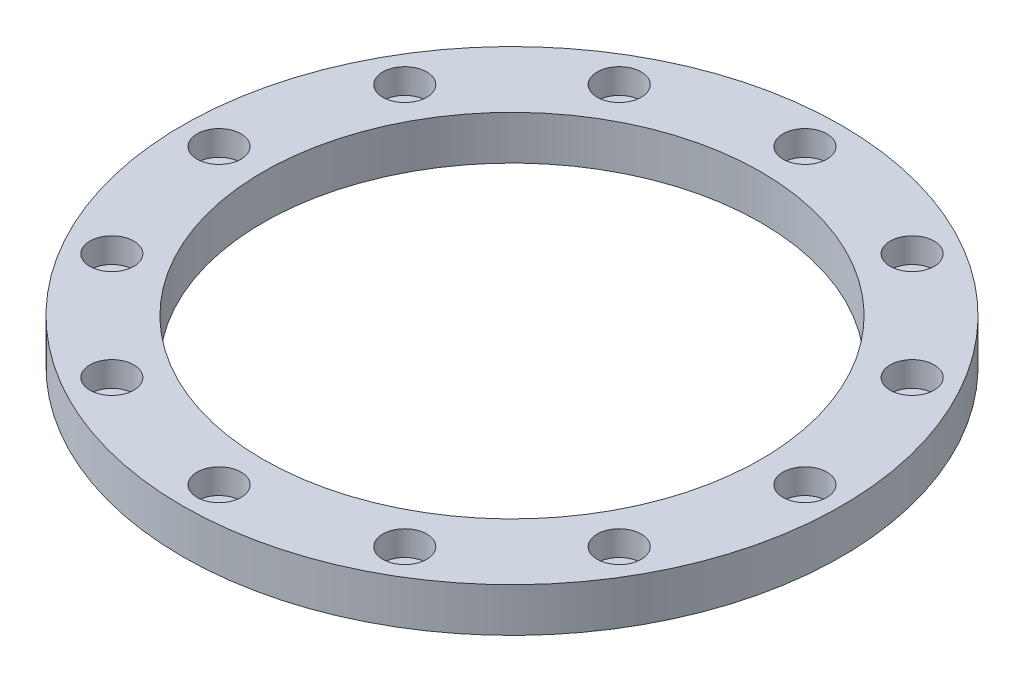
ISO-10303-21;
HEADER;
FILE_DESCRIPTION(('STEP AP214'),'2;1');
FILE_NAME('part.step','',(''),(''),'','','');
FILE_SCHEMA(('AUTOMOTIVE_DESIGN { 1 0 10303 214 1 1 1 1 }'));
ENDSEC;
DATA;
#1=APPLICATION_CONTEXT('core data for automotive mechanical design processes');
#2=APPLICATION_PROTOCOL_DEFINITION('international standard','automotive_design',2000,#1);
#3=PRODUCT_CONTEXT('',#1,'mechanical');
#4=PRODUCT('Part','Part','',(#3));
#5=PRODUCT_RELATED_PRODUCT_CATEGORY('part','',(#4));
#6=PRODUCT_DEFINITION_FORMATION('','',#4);
#7=PRODUCT_DEFINITION_CONTEXT('part definition',#1,'design');
#8=PRODUCT_DEFINITION('design','',#6,#7);
#9=PRODUCT_DEFINITION_SHAPE('','',#8);
#10=(LENGTH_UNIT() NAMED_UNIT(*) SI_UNIT(.MILLI.,.METRE.));
#11=(NAMED_UNIT(*) PLANE_ANGLE_UNIT() SI_UNIT($,.RADIAN.));
#12=(NAMED_UNIT(*) SI_UNIT($,.STERADIAN.) SOLID_ANGLE_UNIT());
#13=UNCERTAINTY_MEASURE_WITH_UNIT(LENGTH_MEASURE(1.E-05),#10,'distance_accuracy_value','');
#14=(GEOMETRIC_REPRESENTATION_CONTEXT(3) GLOBAL_UNCERTAINTY_ASSIGNED_CONTEXT((#13)) GLOBAL_UNIT_ASSIGNED_CONTEXT((#10,
#11,#12)) REPRESENTATION_CONTEXT('',''));
#15=CARTESIAN_POINT('',(0.,0.,0.));
#16=DIRECTION('',(0.,0.,1.));
#17=DIRECTION('',(1.,0.,0.));
#18=AXIS2_PLACEMENT_3D('',#15,#16,#17);
#19=CARTESIAN_POINT('',(0.,6.,0.));
#20=DIRECTION('',(0.,1.,0.));
#21=DIRECTION('',(0.,0.,1.));
#22=AXIS2_PLACEMENT_3D('',#19,#20,#21);
#23=PLANE('',#22);
#24=CARTESIAN_POINT('',(-19.9999999999996,6.,-34.6410161513778));
#25=DIRECTION('',(0.,1.,0.));
#26=DIRECTION('',(0.,0.,1.));
#27=AXIS2_PLACEMENT_3D('',#24,#25,#26);
#28=CIRCLE('',#27,3.);
#29=CARTESIAN_POINT('',(-19.9999999999996,6.,-31.6410161513778));
#30=VERTEX_POINT('',#29);
#31=EDGE_CURVE('E192',#30,#30,#28,.T.);
#32=ORIENTED_EDGE('',*,*,#31,.F.);
#33=EDGE_LOOP('',(#32));
#34=FACE_BOUND('',#33,.T.);
#35=CARTESIAN_POINT('',(-34.6410161513773,6.,-20.0000000000004));
#36=DIRECTION('',(0.,1.,0.));
#37=DIRECTION('',(0.,0.,1.));
#38=AXIS2_PLACEMENT_3D('',#35,#36,#37);
#39=CIRCLE('',#38,3.);
#40=CARTESIAN_POINT('',(-34.6410161513773,6.,-17.0000000000004));
#41=VERTEX_POINT('',#40);
#42=EDGE_CURVE('E180',#41,#41,#39,.T.);
#43=ORIENTED_EDGE('',*,*,#42,.F.);
#44=EDGE_LOOP('',(#43));
#45=FACE_BOUND('',#44,.T.);
#46=CARTESIAN_POINT('',(-40.,6.,-4.18977760661176E-13));
#47=DIRECTION('',(0.,1.,0.));
#48=DIRECTION('',(0.,0.,1.));
#49=AXIS2_PLACEMENT_3D('',#46,#47,#48);
#50=CIRCLE('',#49,3.);
#51=CARTESIAN_POINT('',(-40.,6.,2.99999999999958));
#52=VERTEX_POINT('',#51);
#53=EDGE_CURVE('E168',#52,#52,#50,.T.);
#54=ORIENTED_EDGE('',*,*,#53,.F.);
#55=EDGE_LOOP('',(#54));
#56=FACE_BOUND('',#55,.T.);
#57=CARTESIAN_POINT('',(-34.6410161513777,6.,19.9999999999997));
#58=DIRECTION('',(0.,1.,0.));
#59=DIRECTION('',(0.,0.,1.));
#60=AXIS2_PLACEMENT_3D('',#57,#58,#59);
#61=CIRCLE('',#60,3.);
#62=CARTESIAN_POINT('',(-34.6410161513777,6.,22.9999999999997));
#63=VERTEX_POINT('',#62);
#64=EDGE_CURVE('E156',#63,#63,#61,.T.);
#65=ORIENTED_EDGE('',*,*,#64,.F.);
#66=EDGE_LOOP('',(#65));
#67=FACE_BOUND('',#66,.T.);
#68=CARTESIAN_POINT('',(-20.0000000000003,6.,34.6410161513774));
#69=DIRECTION('',(0.,1.,0.));
#70=DIRECTION('',(0.,0.,1.));
#71=AXIS2_PLACEMENT_3D('',#68,#69,#70);
#72=CIRCLE('',#71,3.);
#73=CARTESIAN_POINT('',(-20.0000000000003,6.,37.6410161513774));
#74=VERTEX_POINT('',#73);
#75=EDGE_CURVE('E144',#74,#74,#72,.T.);
#76=ORIENTED_EDGE('',*,*,#75,.F.);
#77=EDGE_LOOP('',(#76));
#78=FACE_BOUND('',#77,.T.);
#79=CARTESIAN_POINT('',(0.,6.,40.));
#80=DIRECTION('',(0.,1.,0.));
#81=DIRECTION('',(0.,0.,1.));
#82=AXIS2_PLACEMENT_3D('',#79,#80,#81);
#83=CIRCLE('',#82,3.);
#84=CARTESIAN_POINT('',(0.,6.,43.));
#85=VERTEX_POINT('',#84);
#86=EDGE_CURVE('E132',#85,#85,#83,.T.);
#87=ORIENTED_EDGE('',*,*,#86,.F.);
#88=EDGE_LOOP('',(#87));
#89=FACE_BOUND('',#88,.T.);
#90=CARTESIAN_POINT('',(19.9999999999998,6.,34.6410161513777));
#91=DIRECTION('',(0.,1.,0.));
#92=DIRECTION('',(0.,0.,1.));
#93=AXIS2_PLACEMENT_3D('',#90,#91,#92);
#94=CIRCLE('',#93,3.);
#95=CARTESIAN_POINT('',(19.9999999999998,6.,37.6410161513777));
#96=VERTEX_POINT('',#95);
#97=EDGE_CURVE('E120',#96,#96,#94,.T.);
#98=ORIENTED_EDGE('',*,*,#97,.F.);
#99=EDGE_LOOP('',(#98));
#100=FACE_BOUND('',#99,.T.);
#101=CARTESIAN_POINT('',(34.6410161513775,6.,20.0000000000002));
#102=DIRECTION('',(0.,1.,0.));
#103=DIRECTION('',(0.,0.,1.));
#104=AXIS2_PLACEMENT_3D('',#101,#102,#103);
#105=CIRCLE('',#104,3.);
#106=CARTESIAN_POINT('',(34.6410161513775,6.,23.0000000000002));
#107=VERTEX_POINT('',#106);
#108=EDGE_CURVE('E108',#107,#107,#105,.T.);
#109=ORIENTED_EDGE('',*,*,#108,.F.);
#110=EDGE_LOOP('',(#109));
#111=FACE_BOUND('',#110,.T.);
#112=CARTESIAN_POINT('',(40.,6.,1.39659253553725E-13));
#113=DIRECTION('',(0.,1.,0.));
#114=DIRECTION('',(0.,0.,1.));
#115=AXIS2_PLACEMENT_3D('',#112,#113,#114);
#116=CIRCLE('',#115,3.);
#117=CARTESIAN_POINT('',(40.,6.,3.00000000000014));
#118=VERTEX_POINT('',#117);
#119=EDGE_CURVE('E96',#118,#118,#116,.T.);
#120=ORIENTED_EDGE('',*,*,#119,.F.);
#121=EDGE_LOOP('',(#120));
#122=FACE_BOUND('',#121,.T.);
#123=CARTESIAN_POINT('',(34.6410161513776,6.,-19.9999999999999));
#124=DIRECTION('',(0.,1.,0.));
#125=DIRECTION('',(0.,0.,1.));
#126=AXIS2_PLACEMENT_3D('',#123,#124,#125);
#127=CIRCLE('',#126,3.);
#128=CARTESIAN_POINT('',(34.6410161513776,6.,-16.9999999999999));
#129=VERTEX_POINT('',#128);
#130=EDGE_CURVE('E84',#129,#129,#127,.T.);
#131=ORIENTED_EDGE('',*,*,#130,.F.);
#132=EDGE_LOOP('',(#131));
#133=FACE_BOUND('',#132,.T.);
#134=CARTESIAN_POINT('',(20.,6.,-34.6410161513775));
#135=DIRECTION('',(0.,1.,0.));
#136=DIRECTION('',(0.,0.,1.));
#137=AXIS2_PLACEMENT_3D('',#134,#135,#136);
#138=CIRCLE('',#137,3.);
#139=CARTESIAN_POINT('',(20.,6.,-31.6410161513775));
#140=VERTEX_POINT('',#139);
#141=EDGE_CURVE('E72',#140,#140,#138,.T.);
#142=ORIENTED_EDGE('',*,*,#141,.F.);
#143=EDGE_LOOP('',(#142));
#144=FACE_BOUND('',#143,.T.);
#145=CARTESIAN_POINT('',(0.,6.,-40.));
#146=DIRECTION('',(0.,1.,0.));
#147=DIRECTION('',(0.,0.,1.));
#148=AXIS2_PLACEMENT_3D('',#145,#146,#147);
#149=CIRCLE('',#148,3.);
#150=CARTESIAN_POINT('',(0.,6.,-37.));
#151=VERTEX_POINT('',#150);
#152=EDGE_CURVE('E60',#151,#151,#149,.T.);
#153=ORIENTED_EDGE('',*,*,#152,.F.);
#154=EDGE_LOOP('',(#153));
#155=FACE_BOUND('',#154,.T.);
#156=CARTESIAN_POINT('',(0.,6.,0.));
#157=DIRECTION('',(0.,1.,0.));
#158=DIRECTION('',(0.,0.,1.));
#159=AXIS2_PLACEMENT_3D('',#156,#157,#158);
#160=CIRCLE('',#159,45.);
#161=CARTESIAN_POINT('',(0.,6.,45.));
#162=VERTEX_POINT('',#161);
#163=EDGE_CURVE('E10',#162,#162,#160,.T.);
#164=ORIENTED_EDGE('',*,*,#163,.T.);
#165=EDGE_LOOP('',(#164));
#166=FACE_BOUND('',#165,.T.);
#167=CARTESIAN_POINT('',(0.,6.,0.));
#168=DIRECTION('',(0.,1.,0.));
#169=DIRECTION('',(0.,0.,1.));
#170=AXIS2_PLACEMENT_3D('',#167,#168,#169);
#171=CIRCLE('',#170,34.);
#172=CARTESIAN_POINT('',(0.,6.,34.));
#173=VERTEX_POINT('',#172);
#174=EDGE_CURVE('E44',#173,#173,#171,.T.);
#175=ORIENTED_EDGE('',*,*,#174,.F.);
#176=EDGE_LOOP('',(#175));
#177=FACE_BOUND('',#176,.T.);
#178=ADVANCED_FACE('F33',(#34,#45,#56,#67,#78,#89,#100,#111,#122,#133,#144,#155,#166,#177),#23,.T.);
#179=CARTESIAN_POINT('',(0.,0.,0.));
#180=DIRECTION('',(0.,1.,0.));
#181=DIRECTION('',(0.,0.,1.));
#182=AXIS2_PLACEMENT_3D('',#179,#180,#181);
#183=PLANE('',#182);
#184=CARTESIAN_POINT('',(-19.9999999999996,0.,-34.6410161513778));
#185=DIRECTION('',(0.,1.,0.));
#186=DIRECTION('',(0.,0.,1.));
#187=AXIS2_PLACEMENT_3D('',#184,#185,#186);
#188=CIRCLE('',#187,1.8);
#189=CARTESIAN_POINT('',(-19.9999999999996,0.,-32.8410161513778));
#190=VERTEX_POINT('',#189);
#191=EDGE_CURVE('E183',#190,#190,#188,.T.);
#192=ORIENTED_EDGE('',*,*,#191,.T.);
#193=EDGE_LOOP('',(#192));
#194=FACE_BOUND('',#193,.T.);
#195=CARTESIAN_POINT('',(-34.6410161513773,0.,-20.0000000000004));
#196=DIRECTION('',(0.,1.,0.));
#197=DIRECTION('',(0.,0.,1.));
#198=AXIS2_PLACEMENT_3D('',#195,#196,#197);
#199=CIRCLE('',#198,1.8);
#200=CARTESIAN_POINT('',(-34.6410161513773,0.,-18.2000000000004));
#201=VERTEX_POINT('',#200);
#202=EDGE_CURVE('E171',#201,#201,#199,.T.);
#203=ORIENTED_EDGE('',*,*,#202,.T.);
#204=EDGE_LOOP('',(#203));
#205=FACE_BOUND('',#204,.T.);
#206=CARTESIAN_POINT('',(-40.,0.,-4.18977760661176E-13));
#207=DIRECTION('',(0.,1.,0.));
#208=DIRECTION('',(0.,0.,1.));
#209=AXIS2_PLACEMENT_3D('',#206,#207,#208);
#210=CIRCLE('',#209,1.8);
#211=CARTESIAN_POINT('',(-40.,0.,1.79999999999958));
#212=VERTEX_POINT('',#211);
#213=EDGE_CURVE('E159',#212,#212,#210,.T.);
#214=ORIENTED_EDGE('',*,*,#213,.T.);
#215=EDGE_LOOP('',(#214));
#216=FACE_BOUND('',#215,.T.);
#217=CARTESIAN_POINT('',(-34.6410161513777,0.,19.9999999999997));
#218=DIRECTION('',(0.,1.,0.));
#219=DIRECTION('',(0.,0.,1.));
#220=AXIS2_PLACEMENT_3D('',#217,#218,#219);
#221=CIRCLE('',#220,1.8);
#222=CARTESIAN_POINT('',(-34.6410161513777,0.,21.7999999999997));
#223=VERTEX_POINT('',#222);
#224=EDGE_CURVE('E147',#223,#223,#221,.T.);
#225=ORIENTED_EDGE('',*,*,#224,.T.);
#226=EDGE_LOOP('',(#225));
#227=FACE_BOUND('',#226,.T.);
#228=CARTESIAN_POINT('',(-20.0000000000003,0.,34.6410161513774));
#229=DIRECTION('',(0.,1.,0.));
#230=DIRECTION('',(0.,0.,1.));
#231=AXIS2_PLACEMENT_3D('',#228,#229,#230);
#232=CIRCLE('',#231,1.8);
#233=CARTESIAN_POINT('',(-20.0000000000003,0.,36.4410161513774));
#234=VERTEX_POINT('',#233);
#235=EDGE_CURVE('E135',#234,#234,#232,.T.);
#236=ORIENTED_EDGE('',*,*,#235,.T.);
#237=EDGE_LOOP('',(#236));
#238=FACE_BOUND('',#237,.T.);
#239=CARTESIAN_POINT('',(0.,0.,40.));
#240=DIRECTION('',(0.,1.,0.));
#241=DIRECTION('',(0.,0.,1.));
#242=AXIS2_PLACEMENT_3D('',#239,#240,#241);
#243=CIRCLE('',#242,1.8);
#244=CARTESIAN_POINT('',(0.,0.,41.8));
#245=VERTEX_POINT('',#244);
#246=EDGE_CURVE('E123',#245,#245,#243,.T.);
#247=ORIENTED_EDGE('',*,*,#246,.T.);
#248=EDGE_LOOP('',(#247));
#249=FACE_BOUND('',#248,.T.);
#250=CARTESIAN_POINT('',(19.9999999999998,0.,34.6410161513777));
#251=DIRECTION('',(0.,1.,0.));
#252=DIRECTION('',(0.,0.,1.));
#253=AXIS2_PLACEMENT_3D('',#250,#251,#252);
#254=CIRCLE('',#253,1.8);
#255=CARTESIAN_POINT('',(19.9999999999998,0.,36.4410161513777));
#256=VERTEX_POINT('',#255);
#257=EDGE_CURVE('E111',#256,#256,#254,.T.);
#258=ORIENTED_EDGE('',*,*,#257,.T.);
#259=EDGE_LOOP('',(#258));
#260=FACE_BOUND('',#259,.T.);
#261=CARTESIAN_POINT('',(34.6410161513775,0.,20.0000000000002));
#262=DIRECTION('',(0.,1.,0.));
#263=DIRECTION('',(0.,0.,1.));
#264=AXIS2_PLACEMENT_3D('',#261,#262,#263);
#265=CIRCLE('',#264,1.8);
#266=CARTESIAN_POINT('',(34.6410161513775,0.,21.8000000000002));
#267=VERTEX_POINT('',#266);
#268=EDGE_CURVE('E99',#267,#267,#265,.T.);
#269=ORIENTED_EDGE('',*,*,#268,.T.);
#270=EDGE_LOOP('',(#269));
#271=FACE_BOUND('',#270,.T.);
#272=CARTESIAN_POINT('',(40.,0.,1.39659253553725E-13));
#273=DIRECTION('',(0.,1.,0.));
#274=DIRECTION('',(0.,0.,1.));
#275=AXIS2_PLACEMENT_3D('',#272,#273,#274);
#276=CIRCLE('',#275,1.8);
#277=CARTESIAN_POINT('',(40.,0.,1.80000000000014));
#278=VERTEX_POINT('',#277);
#279=EDGE_CURVE('E87',#278,#278,#276,.T.);
#280=ORIENTED_EDGE('',*,*,#279,.T.);
#281=EDGE_LOOP('',(#280));
#282=FACE_BOUND('',#281,.T.);
#283=CARTESIAN_POINT('',(34.6410161513776,0.,-19.9999999999999));
#284=DIRECTION('',(0.,1.,0.));
#285=DIRECTION('',(0.,0.,1.));
#286=AXIS2_PLACEMENT_3D('',#283,#284,#285);
#287=CIRCLE('',#286,1.8);
#288=CARTESIAN_POINT('',(34.6410161513776,0.,-18.1999999999999));
#289=VERTEX_POINT('',#288);
#290=EDGE_CURVE('E75',#289,#289,#287,.T.);
#291=ORIENTED_EDGE('',*,*,#290,.T.);
#292=EDGE_LOOP('',(#291));
#293=FACE_BOUND('',#292,.T.);
#294=CARTESIAN_POINT('',(20.,0.,-34.6410161513775));
#295=DIRECTION('',(0.,1.,0.));
#296=DIRECTION('',(0.,0.,1.));
#297=AXIS2_PLACEMENT_3D('',#294,#295,#296);
#298=CIRCLE('',#297,1.8);
#299=CARTESIAN_POINT('',(20.,0.,-32.8410161513775));
#300=VERTEX_POINT('',#299);
#301=EDGE_CURVE('E63',#300,#300,#298,.T.);
#302=ORIENTED_EDGE('',*,*,#301,.T.);
#303=EDGE_LOOP('',(#302));
#304=FACE_BOUND('',#303,.T.);
#305=CARTESIAN_POINT('',(0.,0.,-40.));
#306=DIRECTION('',(0.,1.,0.));
#307=DIRECTION('',(0.,0.,1.));
#308=AXIS2_PLACEMENT_3D('',#305,#306,#307);
#309=CIRCLE('',#308,1.8);
#310=CARTESIAN_POINT('',(0.,0.,-38.2));
#311=VERTEX_POINT('',#310);
#312=EDGE_CURVE('E49',#311,#311,#309,.T.);
#313=ORIENTED_EDGE('',*,*,#312,.T.);
#314=EDGE_LOOP('',(#313));
#315=FACE_BOUND('',#314,.T.);
#316=CARTESIAN_POINT('',(0.,0.,0.));
#317=DIRECTION('',(0.,1.,0.));
#318=DIRECTION('',(0.,0.,1.));
#319=AXIS2_PLACEMENT_3D('',#316,#317,#318);
#320=CIRCLE('',#319,45.);
#321=CARTESIAN_POINT('',(0.,0.,45.));
#322=VERTEX_POINT('',#321);
#323=EDGE_CURVE('E37',#322,#322,#320,.T.);
#324=ORIENTED_EDGE('',*,*,#323,.F.);
#325=EDGE_LOOP('',(#324));
#326=FACE_BOUND('',#325,.T.);
#327=CARTESIAN_POINT('',(0.,0.,0.));
#328=DIRECTION('',(0.,1.,0.));
#329=DIRECTION('',(0.,0.,1.));
#330=AXIS2_PLACEMENT_3D('',#327,#328,#329);
#331=CIRCLE('',#330,34.);
#332=CARTESIAN_POINT('',(0.,0.,34.));
#333=VERTEX_POINT('',#332);
#334=EDGE_CURVE('E46',#333,#333,#331,.T.);
#335=ORIENTED_EDGE('',*,*,#334,.T.);
#336=EDGE_LOOP('',(#335));
#337=FACE_BOUND('',#336,.T.);
#338=ADVANCED_FACE('F200',(#194,#205,#216,#227,#238,#249,#260,#271,#282,#293,#304,#315,#326,
#337),#183,.F.);
#339=CARTESIAN_POINT('',(0.,6.,0.));
#340=DIRECTION('',(0.,-1.,0.));
#341=DIRECTION('',(0.,0.,-1.));
#342=AXIS2_PLACEMENT_3D('',#339,#340,#341);
#343=CYLINDRICAL_SURFACE('',#342,45.);
#344=ORIENTED_EDGE('',*,*,#163,.F.);
#345=EDGE_LOOP('',(#344));
#346=FACE_BOUND('',#345,.T.);
#347=ORIENTED_EDGE('',*,*,#323,.T.);
#348=EDGE_LOOP('',(#347));
#349=FACE_BOUND('',#348,.T.);
#350=ADVANCED_FACE('F35',(#346,#349),#343,.T.);
#351=CARTESIAN_POINT('',(0.,6.,0.));
#352=DIRECTION('',(0.,-1.,0.));
#353=DIRECTION('',(0.,0.,-1.));
#354=AXIS2_PLACEMENT_3D('',#351,#352,#353);
#355=CYLINDRICAL_SURFACE('',#354,34.);
#356=ORIENTED_EDGE('',*,*,#174,.T.);
#357=EDGE_LOOP('',(#356));
#358=FACE_BOUND('',#357,.T.);
#359=ORIENTED_EDGE('',*,*,#334,.F.);
#360=EDGE_LOOP('',(#359));
#361=FACE_BOUND('',#360,.T.);
#362=ADVANCED_FACE('F226',(#358,#361),#355,.F.);
#363=CARTESIAN_POINT('',(0.,6.,-40.));
#364=DIRECTION('',(0.,1.,0.));
#365=DIRECTION('',(0.,0.,1.));
#366=AXIS2_PLACEMENT_3D('',#363,#364,#365);
#367=CYLINDRICAL_SURFACE('',#366,1.8);
#368=ORIENTED_EDGE('',*,*,#312,.F.);
#369=EDGE_LOOP('',(#368));
#370=FACE_BOUND('',#369,.T.);
#371=CARTESIAN_POINT('',(0.,2.6,-40.));
#372=DIRECTION('',(0.,1.,0.));
#373=DIRECTION('',(0.,0.,1.));
#374=AXIS2_PLACEMENT_3D('',#371,#372,#373);
#375=CIRCLE('',#374,1.8);
#376=CARTESIAN_POINT('',(0.,2.6,-38.2));
#377=VERTEX_POINT('',#376);
#378=EDGE_CURVE('E54',#377,#377,#375,.T.);
#379=ORIENTED_EDGE('',*,*,#378,.T.);
#380=EDGE_LOOP('',(#379));
#381=FACE_BOUND('',#380,.T.);
#382=ADVANCED_FACE('F229',(#370,#381),#367,.F.);
#383=CARTESIAN_POINT('',(1.8,2.6,-40.));
#384=DIRECTION('',(0.,-1.,0.));
#385=DIRECTION('',(0.,0.,-1.));
#386=AXIS2_PLACEMENT_3D('',#383,#384,#385);
#387=PLANE('',#386);
#388=ORIENTED_EDGE('',*,*,#378,.F.);
#389=EDGE_LOOP('',(#388));
#390=FACE_BOUND('',#389,.T.);
#391=CARTESIAN_POINT('',(0.,2.6,-40.));
#392=DIRECTION('',(0.,1.,0.));
#393=DIRECTION('',(0.,0.,1.));
#394=AXIS2_PLACEMENT_3D('',#391,#392,#393);
#395=CIRCLE('',#394,3.);
#396=CARTESIAN_POINT('',(0.,2.6,-37.));
#397=VERTEX_POINT('',#396);
#398=EDGE_CURVE('E57',#397,#397,#395,.T.);
#399=ORIENTED_EDGE('',*,*,#398,.T.);
#400=EDGE_LOOP('',(#399));
#401=FACE_BOUND('',#400,.T.);
#402=ADVANCED_FACE('F243',(#390,#401),#387,.F.);
#403=CARTESIAN_POINT('',(0.,6.,-40.));
#404=DIRECTION('',(0.,1.,0.));
#405=DIRECTION('',(0.,0.,1.));
#406=AXIS2_PLACEMENT_3D('',#403,#404,#405);
#407=CYLINDRICAL_SURFACE('',#406,3.);
#408=ORIENTED_EDGE('',*,*,#398,.F.);
#409=EDGE_LOOP('',(#408));
#410=FACE_BOUND('',#409,.T.);
#411=ORIENTED_EDGE('',*,*,#152,.T.);
#412=EDGE_LOOP('',(#411));
#413=FACE_BOUND('',#412,.T.);
#414=ADVANCED_FACE('F247',(#410,#413),#407,.F.);
#415=CARTESIAN_POINT('',(20.,6.,-34.6410161513775));
#416=DIRECTION('',(0.,1.,0.));
#417=DIRECTION('',(0.,0.,1.));
#418=AXIS2_PLACEMENT_3D('',#415,#416,#417);
#419=CYLINDRICAL_SURFACE('',#418,1.8);
#420=ORIENTED_EDGE('',*,*,#301,.F.);
#421=EDGE_LOOP('',(#420));
#422=FACE_BOUND('',#421,.T.);
#423=CARTESIAN_POINT('',(20.,2.6,-34.6410161513775));
#424=DIRECTION('',(0.,1.,0.));
#425=DIRECTION('',(0.,0.,1.));
#426=AXIS2_PLACEMENT_3D('',#423,#424,#425);
#427=CIRCLE('',#426,1.8);
#428=CARTESIAN_POINT('',(20.,2.6,-32.8410161513775));
#429=VERTEX_POINT('',#428);
#430=EDGE_CURVE('E66',#429,#429,#427,.T.);
#431=ORIENTED_EDGE('',*,*,#430,.T.);
#432=EDGE_LOOP('',(#431));
#433=FACE_BOUND('',#432,.T.);
#434=ADVANCED_FACE('F251',(#422,#433),#419,.F.);
#435=CARTESIAN_POINT('',(21.8,2.6,-34.6410161513775));
#436=DIRECTION('',(0.,-1.,0.));
#437=DIRECTION('',(0.,0.,-1.));
#438=AXIS2_PLACEMENT_3D('',#435,#436,#437);
#439=PLANE('',#438);
#440=ORIENTED_EDGE('',*,*,#430,.F.);
#441=EDGE_LOOP('',(#440));
#442=FACE_BOUND('',#441,.T.);
#443=CARTESIAN_POINT('',(20.,2.6,-34.6410161513775));
#444=DIRECTION('',(0.,1.,0.));
#445=DIRECTION('',(0.,0.,1.));
#446=AXIS2_PLACEMENT_3D('',#443,#444,#445);
#447=CIRCLE('',#446,3.);
#448=CARTESIAN_POINT('',(20.,2.6,-31.6410161513775));
#449=VERTEX_POINT('',#448);
#450=EDGE_CURVE('E69',#449,#449,#447,.T.);
#451=ORIENTED_EDGE('',*,*,#450,.T.);
#452=EDGE_LOOP('',(#451));
#453=FACE_BOUND('',#452,.T.);
#454=ADVANCED_FACE('F255',(#442,#453),#439,.F.);
#455=CARTESIAN_POINT('',(20.,6.,-34.6410161513775));
#456=DIRECTION('',(0.,1.,0.));
#457=DIRECTION('',(0.,0.,1.));
#458=AXIS2_PLACEMENT_3D('',#455,#456,#457);
#459=CYLINDRICAL_SURFACE('',#458,3.);
#460=ORIENTED_EDGE('',*,*,#450,.F.);
#461=EDGE_LOOP('',(#460));
#462=FACE_BOUND('',#461,.T.);
#463=ORIENTED_EDGE('',*,*,#141,.T.);
#464=EDGE_LOOP('',(#463));
#465=FACE_BOUND('',#464,.T.);
#466=ADVANCED_FACE('F259',(#462,#465),#459,.F.);
#467=CARTESIAN_POINT('',(34.6410161513776,6.,-19.9999999999999));
#468=DIRECTION('',(0.,1.,0.));
#469=DIRECTION('',(0.,0.,1.));
#470=AXIS2_PLACEMENT_3D('',#467,#468,#469);
#471=CYLINDRICAL_SURFACE('',#470,1.8);
#472=ORIENTED_EDGE('',*,*,#290,.F.);
#473=EDGE_LOOP('',(#472));
#474=FACE_BOUND('',#473,.T.);
#475=CARTESIAN_POINT('',(34.6410161513776,2.6,-19.9999999999999));
#476=DIRECTION('',(0.,1.,0.));
#477=DIRECTION('',(0.,0.,1.));
#478=AXIS2_PLACEMENT_3D('',#475,#476,#477);
#479=CIRCLE('',#478,1.8);
#480=CARTESIAN_POINT('',(34.6410161513776,2.6,-18.1999999999999));
#481=VERTEX_POINT('',#480);
#482=EDGE_CURVE('E78',#481,#481,#479,.T.);
#483=ORIENTED_EDGE('',*,*,#482,.T.);
#484=EDGE_LOOP('',(#483));
#485=FACE_BOUND('',#484,.T.);
#486=ADVANCED_FACE('F263',(#474,#485),#471,.F.);
#487=CARTESIAN_POINT('',(36.4410161513776,2.6,-19.9999999999999));
#488=DIRECTION('',(0.,-1.,0.));
#489=DIRECTION('',(0.,0.,-1.));
#490=AXIS2_PLACEMENT_3D('',#487,#488,#489);
#491=PLANE('',#490);
#492=ORIENTED_EDGE('',*,*,#482,.F.);
#493=EDGE_LOOP('',(#492));
#494=FACE_BOUND('',#493,.T.);
#495=CARTESIAN_POINT('',(34.6410161513776,2.6,-19.9999999999999));
#496=DIRECTION('',(0.,1.,0.));
#497=DIRECTION('',(0.,0.,1.));
#498=AXIS2_PLACEMENT_3D('',#495,#496,#497);
#499=CIRCLE('',#498,3.);
#500=CARTESIAN_POINT('',(34.6410161513776,2.6,-16.9999999999999));
#501=VERTEX_POINT('',#500);
#502=EDGE_CURVE('E81',#501,#501,#499,.T.);
#503=ORIENTED_EDGE('',*,*,#502,.T.);
#504=EDGE_LOOP('',(#503));
#505=FACE_BOUND('',#504,.T.);
#506=ADVANCED_FACE('F267',(#494,#505),#491,.F.);
#507=CARTESIAN_POINT('',(34.6410161513776,6.,-19.9999999999999));
#508=DIRECTION('',(0.,1.,0.));
#509=DIRECTION('',(0.,0.,1.));
#510=AXIS2_PLACEMENT_3D('',#507,#508,#509);
#511=CYLINDRICAL_SURFACE('',#510,3.);
#512=ORIENTED_EDGE('',*,*,#502,.F.);
#513=EDGE_LOOP('',(#512));
#514=FACE_BOUND('',#513,.T.);
#515=ORIENTED_EDGE('',*,*,#130,.T.);
#516=EDGE_LOOP('',(#515));
#517=FACE_BOUND('',#516,.T.);
#518=ADVANCED_FACE('F271',(#514,#517),#511,.F.);
#519=CARTESIAN_POINT('',(40.,6.,1.39659253553725E-13));
#520=DIRECTION('',(0.,1.,0.));
#521=DIRECTION('',(0.,0.,1.));
#522=AXIS2_PLACEMENT_3D('',#519,#520,#521);
#523=CYLINDRICAL_SURFACE('',#522,1.8);
#524=ORIENTED_EDGE('',*,*,#279,.F.);
#525=EDGE_LOOP('',(#524));
#526=FACE_BOUND('',#525,.T.);
#527=CARTESIAN_POINT('',(40.,2.6,1.39659253553725E-13));
#528=DIRECTION('',(0.,1.,0.));
#529=DIRECTION('',(0.,0.,1.));
#530=AXIS2_PLACEMENT_3D('',#527,#528,#529);
#531=CIRCLE('',#530,1.8);
#532=CARTESIAN_POINT('',(40.,2.6,1.80000000000014));
#533=VERTEX_POINT('',#532);
#534=EDGE_CURVE('E90',#533,#533,#531,.T.);
#535=ORIENTED_EDGE('',*,*,#534,.T.);
#536=EDGE_LOOP('',(#535));
#537=FACE_BOUND('',#536,.T.);
#538=ADVANCED_FACE('F275',(#526,#537),#523,.F.);
#539=CARTESIAN_POINT('',(41.8,2.6,1.39659253553725E-13));
#540=DIRECTION('',(0.,-1.,0.));
#541=DIRECTION('',(0.,0.,-1.));
#542=AXIS2_PLACEMENT_3D('',#539,#540,#541);
#543=PLANE('',#542);
#544=ORIENTED_EDGE('',*,*,#534,.F.);
#545=EDGE_LOOP('',(#544));
#546=FACE_BOUND('',#545,.T.);
#547=CARTESIAN_POINT('',(40.,2.6,1.39659253553725E-13));
#548=DIRECTION('',(0.,1.,0.));
#549=DIRECTION('',(0.,0.,1.));
#550=AXIS2_PLACEMENT_3D('',#547,#548,#549);
#551=CIRCLE('',#550,3.);
#552=CARTESIAN_POINT('',(40.,2.6,3.00000000000014));
#553=VERTEX_POINT('',#552);
#554=EDGE_CURVE('E93',#553,#553,#551,.T.);
#555=ORIENTED_EDGE('',*,*,#554,.T.);
#556=EDGE_LOOP('',(#555));
#557=FACE_BOUND('',#556,.T.);
#558=ADVANCED_FACE('F279',(#546,#557),#543,.F.);
#559=CARTESIAN_POINT('',(40.,6.,1.39659253553725E-13));
#560=DIRECTION('',(0.,1.,0.));
#561=DIRECTION('',(0.,0.,1.));
#562=AXIS2_PLACEMENT_3D('',#559,#560,#561);
#563=CYLINDRICAL_SURFACE('',#562,3.);
#564=ORIENTED_EDGE('',*,*,#554,.F.);
#565=EDGE_LOOP('',(#564));
#566=FACE_BOUND('',#565,.T.);
#567=ORIENTED_EDGE('',*,*,#119,.T.);
#568=EDGE_LOOP('',(#567));
#569=FACE_BOUND('',#568,.T.);
#570=ADVANCED_FACE('F283',(#566,#569),#563,.F.);
#571=CARTESIAN_POINT('',(34.6410161513775,6.,20.0000000000002));
#572=DIRECTION('',(0.,1.,0.));
#573=DIRECTION('',(0.,0.,1.));
#574=AXIS2_PLACEMENT_3D('',#571,#572,#573);
#575=CYLINDRICAL_SURFACE('',#574,1.8);
#576=ORIENTED_EDGE('',*,*,#268,.F.);
#577=EDGE_LOOP('',(#576));
#578=FACE_BOUND('',#577,.T.);
#579=CARTESIAN_POINT('',(34.6410161513775,2.6,20.0000000000002));
#580=DIRECTION('',(0.,1.,0.));
#581=DIRECTION('',(0.,0.,1.));
#582=AXIS2_PLACEMENT_3D('',#579,#580,#581);
#583=CIRCLE('',#582,1.8);
#584=CARTESIAN_POINT('',(34.6410161513775,2.6,21.8000000000002));
#585=VERTEX_POINT('',#584);
#586=EDGE_CURVE('E102',#585,#585,#583,.T.);
#587=ORIENTED_EDGE('',*,*,#586,.T.);
#588=EDGE_LOOP('',(#587));
#589=FACE_BOUND('',#588,.T.);
#590=ADVANCED_FACE('F287',(#578,#589),#575,.F.);
#591=CARTESIAN_POINT('',(36.4410161513775,2.6,20.0000000000002));
#592=DIRECTION('',(0.,-1.,0.));
#593=DIRECTION('',(0.,0.,-1.));
#594=AXIS2_PLACEMENT_3D('',#591,#592,#593);
#595=PLANE('',#594);
#596=ORIENTED_EDGE('',*,*,#586,.F.);
#597=EDGE_LOOP('',(#596));
#598=FACE_BOUND('',#597,.T.);
#599=CARTESIAN_POINT('',(34.6410161513775,2.6,20.0000000000002));
#600=DIRECTION('',(0.,1.,0.));
#601=DIRECTION('',(0.,0.,1.));
#602=AXIS2_PLACEMENT_3D('',#599,#600,#601);
#603=CIRCLE('',#602,3.);
#604=CARTESIAN_POINT('',(34.6410161513775,2.6,23.0000000000002));
#605=VERTEX_POINT('',#604);
#606=EDGE_CURVE('E105',#605,#605,#603,.T.);
#607=ORIENTED_EDGE('',*,*,#606,.T.);
#608=EDGE_LOOP('',(#607));
#609=FACE_BOUND('',#608,.T.);
#610=ADVANCED_FACE('F291',(#598,#609),#595,.F.);
#611=CARTESIAN_POINT('',(34.6410161513775,6.,20.0000000000002));
#612=DIRECTION('',(0.,1.,0.));
#613=DIRECTION('',(0.,0.,1.));
#614=AXIS2_PLACEMENT_3D('',#611,#612,#613);
#615=CYLINDRICAL_SURFACE('',#614,3.);
#616=ORIENTED_EDGE('',*,*,#606,.F.);
#617=EDGE_LOOP('',(#616));
#618=FACE_BOUND('',#617,.T.);
#619=ORIENTED_EDGE('',*,*,#108,.T.);
#620=EDGE_LOOP('',(#619));
#621=FACE_BOUND('',#620,.T.);
#622=ADVANCED_FACE('F295',(#618,#621),#615,.F.);
#623=CARTESIAN_POINT('',(19.9999999999998,6.,34.6410161513777));
#624=DIRECTION('',(0.,1.,0.));
#625=DIRECTION('',(0.,0.,1.));
#626=AXIS2_PLACEMENT_3D('',#623,#624,#625);
#627=CYLINDRICAL_SURFACE('',#626,1.8);
#628=ORIENTED_EDGE('',*,*,#257,.F.);
#629=EDGE_LOOP('',(#628));
#630=FACE_BOUND('',#629,.T.);
#631=CARTESIAN_POINT('',(19.9999999999998,2.6,34.6410161513777));
#632=DIRECTION('',(0.,1.,0.));
#633=DIRECTION('',(0.,0.,1.));
#634=AXIS2_PLACEMENT_3D('',#631,#632,#633);
#635=CIRCLE('',#634,1.8);
#636=CARTESIAN_POINT('',(19.9999999999998,2.6,36.4410161513777));
#637=VERTEX_POINT('',#636);
#638=EDGE_CURVE('E114',#637,#637,#635,.T.);
#639=ORIENTED_EDGE('',*,*,#638,.T.);
#640=EDGE_LOOP('',(#639));
#641=FACE_BOUND('',#640,.T.);
#642=ADVANCED_FACE('F299',(#630,#641),#627,.F.);
#643=CARTESIAN_POINT('',(21.7999999999998,2.6,34.6410161513777));
#644=DIRECTION('',(0.,-1.,0.));
#645=DIRECTION('',(0.,0.,-1.));
#646=AXIS2_PLACEMENT_3D('',#643,#644,#645);
#647=PLANE('',#646);
#648=ORIENTED_EDGE('',*,*,#638,.F.);
#649=EDGE_LOOP('',(#648));
#650=FACE_BOUND('',#649,.T.);
#651=CARTESIAN_POINT('',(19.9999999999998,2.6,34.6410161513777));
#652=DIRECTION('',(0.,1.,0.));
#653=DIRECTION('',(0.,0.,1.));
#654=AXIS2_PLACEMENT_3D('',#651,#652,#653);
#655=CIRCLE('',#654,3.);
#656=CARTESIAN_POINT('',(19.9999999999998,2.6,37.6410161513777));
#657=VERTEX_POINT('',#656);
#658=EDGE_CURVE('E117',#657,#657,#655,.T.);
#659=ORIENTED_EDGE('',*,*,#658,.T.);
#660=EDGE_LOOP('',(#659));
#661=FACE_BOUND('',#660,.T.);
#662=ADVANCED_FACE('F303',(#650,#661),#647,.F.);
#663=CARTESIAN_POINT('',(19.9999999999998,6.,34.6410161513777));
#664=DIRECTION('',(0.,1.,0.));
#665=DIRECTION('',(0.,0.,1.));
#666=AXIS2_PLACEMENT_3D('',#663,#664,#665);
#667=CYLINDRICAL_SURFACE('',#666,3.);
#668=ORIENTED_EDGE('',*,*,#658,.F.);
#669=EDGE_LOOP('',(#668));
#670=FACE_BOUND('',#669,.T.);
#671=ORIENTED_EDGE('',*,*,#97,.T.);
#672=EDGE_LOOP('',(#671));
#673=FACE_BOUND('',#672,.T.);
#674=ADVANCED_FACE('F307',(#670,#673),#667,.F.);
#675=CARTESIAN_POINT('',(0.,6.,40.));
#676=DIRECTION('',(0.,1.,0.));
#677=DIRECTION('',(0.,0.,1.));
#678=AXIS2_PLACEMENT_3D('',#675,#676,#677);
#679=CYLINDRICAL_SURFACE('',#678,1.8);
#680=ORIENTED_EDGE('',*,*,#246,.F.);
#681=EDGE_LOOP('',(#680));
#682=FACE_BOUND('',#681,.T.);
#683=CARTESIAN_POINT('',(0.,2.6,40.));
#684=DIRECTION('',(0.,1.,0.));
#685=DIRECTION('',(0.,0.,1.));
#686=AXIS2_PLACEMENT_3D('',#683,#684,#685);
#687=CIRCLE('',#686,1.8);
#688=CARTESIAN_POINT('',(0.,2.6,41.8));
#689=VERTEX_POINT('',#688);
#690=EDGE_CURVE('E126',#689,#689,#687,.T.);
#691=ORIENTED_EDGE('',*,*,#690,.T.);
#692=EDGE_LOOP('',(#691));
#693=FACE_BOUND('',#692,.T.);
#694=ADVANCED_FACE('F311',(#682,#693),#679,.F.);
#695=CARTESIAN_POINT('',(1.8,2.6,40.));
#696=DIRECTION('',(0.,-1.,0.));
#697=DIRECTION('',(0.,0.,-1.));
#698=AXIS2_PLACEMENT_3D('',#695,#696,#697);
#699=PLANE('',#698);
#700=ORIENTED_EDGE('',*,*,#690,.F.);
#701=EDGE_LOOP('',(#700));
#702=FACE_BOUND('',#701,.T.);
#703=CARTESIAN_POINT('',(0.,2.6,40.));
#704=DIRECTION('',(0.,1.,0.));
#705=DIRECTION('',(0.,0.,1.));
#706=AXIS2_PLACEMENT_3D('',#703,#704,#705);
#707=CIRCLE('',#706,3.);
#708=CARTESIAN_POINT('',(0.,2.6,43.));
#709=VERTEX_POINT('',#708);
#710=EDGE_CURVE('E129',#709,#709,#707,.T.);
#711=ORIENTED_EDGE('',*,*,#710,.T.);
#712=EDGE_LOOP('',(#711));
#713=FACE_BOUND('',#712,.T.);
#714=ADVANCED_FACE('F315',(#702,#713),#699,.F.);
#715=CARTESIAN_POINT('',(0.,6.,40.));
#716=DIRECTION('',(0.,1.,0.));
#717=DIRECTION('',(0.,0.,1.));
#718=AXIS2_PLACEMENT_3D('',#715,#716,#717);
#719=CYLINDRICAL_SURFACE('',#718,3.);
#720=ORIENTED_EDGE('',*,*,#710,.F.);
#721=EDGE_LOOP('',(#720));
#722=FACE_BOUND('',#721,.T.);
#723=ORIENTED_EDGE('',*,*,#86,.T.);
#724=EDGE_LOOP('',(#723));
#725=FACE_BOUND('',#724,.T.);
#726=ADVANCED_FACE('F319',(#722,#725),#719,.F.);
#727=CARTESIAN_POINT('',(-20.0000000000003,6.,34.6410161513774));
#728=DIRECTION('',(0.,1.,0.));
#729=DIRECTION('',(0.,0.,1.));
#730=AXIS2_PLACEMENT_3D('',#727,#728,#729);
#731=CYLINDRICAL_SURFACE('',#730,1.8);
#732=ORIENTED_EDGE('',*,*,#235,.F.);
#733=EDGE_LOOP('',(#732));
#734=FACE_BOUND('',#733,.T.);
#735=CARTESIAN_POINT('',(-20.0000000000003,2.6,34.6410161513774));
#736=DIRECTION('',(0.,1.,0.));
#737=DIRECTION('',(0.,0.,1.));
#738=AXIS2_PLACEMENT_3D('',#735,#736,#737);
#739=CIRCLE('',#738,1.8);
#740=CARTESIAN_POINT('',(-20.0000000000003,2.6,36.4410161513774));
#741=VERTEX_POINT('',#740);
#742=EDGE_CURVE('E138',#741,#741,#739,.T.);
#743=ORIENTED_EDGE('',*,*,#742,.T.);
#744=EDGE_LOOP('',(#743));
#745=FACE_BOUND('',#744,.T.);
#746=ADVANCED_FACE('F323',(#734,#745),#731,.F.);
#747=CARTESIAN_POINT('',(-18.2000000000003,2.6,34.6410161513774));
#748=DIRECTION('',(0.,-1.,0.));
#749=DIRECTION('',(0.,0.,-1.));
#750=AXIS2_PLACEMENT_3D('',#747,#748,#749);
#751=PLANE('',#750);
#752=ORIENTED_EDGE('',*,*,#742,.F.);
#753=EDGE_LOOP('',(#752));
#754=FACE_BOUND('',#753,.T.);
#755=CARTESIAN_POINT('',(-20.0000000000003,2.6,34.6410161513774));
#756=DIRECTION('',(0.,1.,0.));
#757=DIRECTION('',(0.,0.,1.));
#758=AXIS2_PLACEMENT_3D('',#755,#756,#757);
#759=CIRCLE('',#758,3.);
#760=CARTESIAN_POINT('',(-20.0000000000003,2.6,37.6410161513774));
#761=VERTEX_POINT('',#760);
#762=EDGE_CURVE('E141',#761,#761,#759,.T.);
#763=ORIENTED_EDGE('',*,*,#762,.T.);
#764=EDGE_LOOP('',(#763));
#765=FACE_BOUND('',#764,.T.);
#766=ADVANCED_FACE('F327',(#754,#765),#751,.F.);
#767=CARTESIAN_POINT('',(-20.0000000000003,6.,34.6410161513774));
#768=DIRECTION('',(0.,1.,0.));
#769=DIRECTION('',(0.,0.,1.));
#770=AXIS2_PLACEMENT_3D('',#767,#768,#769);
#771=CYLINDRICAL_SURFACE('',#770,3.);
#772=ORIENTED_EDGE('',*,*,#762,.F.);
#773=EDGE_LOOP('',(#772));
#774=FACE_BOUND('',#773,.T.);
#775=ORIENTED_EDGE('',*,*,#75,.T.);
#776=EDGE_LOOP('',(#775));
#777=FACE_BOUND('',#776,.T.);
#778=ADVANCED_FACE('F331',(#774,#777),#771,.F.);
#779=CARTESIAN_POINT('',(-34.6410161513777,6.,19.9999999999997));
#780=DIRECTION('',(0.,1.,0.));
#781=DIRECTION('',(0.,0.,1.));
#782=AXIS2_PLACEMENT_3D('',#779,#780,#781);
#783=CYLINDRICAL_SURFACE('',#782,1.8);
#784=ORIENTED_EDGE('',*,*,#224,.F.);
#785=EDGE_LOOP('',(#784));
#786=FACE_BOUND('',#785,.T.);
#787=CARTESIAN_POINT('',(-34.6410161513777,2.6,19.9999999999997));
#788=DIRECTION('',(0.,1.,0.));
#789=DIRECTION('',(0.,0.,1.));
#790=AXIS2_PLACEMENT_3D('',#787,#788,#789);
#791=CIRCLE('',#790,1.8);
#792=CARTESIAN_POINT('',(-34.6410161513777,2.6,21.7999999999997));
#793=VERTEX_POINT('',#792);
#794=EDGE_CURVE('E150',#793,#793,#791,.T.);
#795=ORIENTED_EDGE('',*,*,#794,.T.);
#796=EDGE_LOOP('',(#795));
#797=FACE_BOUND('',#796,.T.);
#798=ADVANCED_FACE('F335',(#786,#797),#783,.F.);
#799=CARTESIAN_POINT('',(-32.8410161513777,2.6,19.9999999999997));
#800=DIRECTION('',(0.,-1.,0.));
#801=DIRECTION('',(0.,0.,-1.));
#802=AXIS2_PLACEMENT_3D('',#799,#800,#801);
#803=PLANE('',#802);
#804=ORIENTED_EDGE('',*,*,#794,.F.);
#805=EDGE_LOOP('',(#804));
#806=FACE_BOUND('',#805,.T.);
#807=CARTESIAN_POINT('',(-34.6410161513777,2.6,19.9999999999997));
#808=DIRECTION('',(0.,1.,0.));
#809=DIRECTION('',(0.,0.,1.));
#810=AXIS2_PLACEMENT_3D('',#807,#808,#809);
#811=CIRCLE('',#810,3.);
#812=CARTESIAN_POINT('',(-34.6410161513777,2.6,22.9999999999997));
#813=VERTEX_POINT('',#812);
#814=EDGE_CURVE('E153',#813,#813,#811,.T.);
#815=ORIENTED_EDGE('',*,*,#814,.T.);
#816=EDGE_LOOP('',(#815));
#817=FACE_BOUND('',#816,.T.);
#818=ADVANCED_FACE('F339',(#806,#817),#803,.F.);
#819=CARTESIAN_POINT('',(-34.6410161513777,6.,19.9999999999997));
#820=DIRECTION('',(0.,1.,0.));
#821=DIRECTION('',(0.,0.,1.));
#822=AXIS2_PLACEMENT_3D('',#819,#820,#821);
#823=CYLINDRICAL_SURFACE('',#822,3.);
#824=ORIENTED_EDGE('',*,*,#814,.F.);
#825=EDGE_LOOP('',(#824));
#826=FACE_BOUND('',#825,.T.);
#827=ORIENTED_EDGE('',*,*,#64,.T.);
#828=EDGE_LOOP('',(#827));
#829=FACE_BOUND('',#828,.T.);
#830=ADVANCED_FACE('F343',(#826,#829),#823,.F.);
#831=CARTESIAN_POINT('',(-40.,6.,-4.18977760661176E-13));
#832=DIRECTION('',(0.,1.,0.));
#833=DIRECTION('',(0.,0.,1.));
#834=AXIS2_PLACEMENT_3D('',#831,#832,#833);
#835=CYLINDRICAL_SURFACE('',#834,1.8);
#836=ORIENTED_EDGE('',*,*,#213,.F.);
#837=EDGE_LOOP('',(#836));
#838=FACE_BOUND('',#837,.T.);
#839=CARTESIAN_POINT('',(-40.,2.6,-4.18977760661176E-13));
#840=DIRECTION('',(0.,1.,0.));
#841=DIRECTION('',(0.,0.,1.));
#842=AXIS2_PLACEMENT_3D('',#839,#840,#841);
#843=CIRCLE('',#842,1.8);
#844=CARTESIAN_POINT('',(-40.,2.6,1.79999999999958));
#845=VERTEX_POINT('',#844);
#846=EDGE_CURVE('E162',#845,#845,#843,.T.);
#847=ORIENTED_EDGE('',*,*,#846,.T.);
#848=EDGE_LOOP('',(#847));
#849=FACE_BOUND('',#848,.T.);
#850=ADVANCED_FACE('F347',(#838,#849),#835,.F.);
#851=CARTESIAN_POINT('',(-38.2,2.6,-4.18977760661176E-13));
#852=DIRECTION('',(0.,-1.,0.));
#853=DIRECTION('',(0.,0.,-1.));
#854=AXIS2_PLACEMENT_3D('',#851,#852,#853);
#855=PLANE('',#854);
#856=ORIENTED_EDGE('',*,*,#846,.F.);
#857=EDGE_LOOP('',(#856));
#858=FACE_BOUND('',#857,.T.);
#859=CARTESIAN_POINT('',(-40.,2.6,-4.18977760661176E-13));
#860=DIRECTION('',(0.,1.,0.));
#861=DIRECTION('',(0.,0.,1.));
#862=AXIS2_PLACEMENT_3D('',#859,#860,#861);
#863=CIRCLE('',#862,3.);
#864=CARTESIAN_POINT('',(-40.,2.6,2.99999999999958));
#865=VERTEX_POINT('',#864);
#866=EDGE_CURVE('E165',#865,#865,#863,.T.);
#867=ORIENTED_EDGE('',*,*,#866,.T.);
#868=EDGE_LOOP('',(#867));
#869=FACE_BOUND('',#868,.T.);
#870=ADVANCED_FACE('F351',(#858,#869),#855,.F.);
#871=CARTESIAN_POINT('',(-40.,6.,-4.18977760661176E-13));
#872=DIRECTION('',(0.,1.,0.));
#873=DIRECTION('',(0.,0.,1.));
#874=AXIS2_PLACEMENT_3D('',#871,#872,#873);
#875=CYLINDRICAL_SURFACE('',#874,3.);
#876=ORIENTED_EDGE('',*,*,#866,.F.);
#877=EDGE_LOOP('',(#876));
#878=FACE_BOUND('',#877,.T.);
#879=ORIENTED_EDGE('',*,*,#53,.T.);
#880=EDGE_LOOP('',(#879));
#881=FACE_BOUND('',#880,.T.);
#882=ADVANCED_FACE('F355',(#878,#881),#875,.F.);
#883=CARTESIAN_POINT('',(-34.6410161513773,6.,-20.0000000000004));
#884=DIRECTION('',(0.,1.,0.));
#885=DIRECTION('',(0.,0.,1.));
#886=AXIS2_PLACEMENT_3D('',#883,#884,#885);
#887=CYLINDRICAL_SURFACE('',#886,1.8);
#888=ORIENTED_EDGE('',*,*,#202,.F.);
#889=EDGE_LOOP('',(#888));
#890=FACE_BOUND('',#889,.T.);
#891=CARTESIAN_POINT('',(-34.6410161513773,2.6,-20.0000000000004));
#892=DIRECTION('',(0.,1.,0.));
#893=DIRECTION('',(0.,0.,1.));
#894=AXIS2_PLACEMENT_3D('',#891,#892,#893);
#895=CIRCLE('',#894,1.8);
#896=CARTESIAN_POINT('',(-34.6410161513773,2.6,-18.2000000000004));
#897=VERTEX_POINT('',#896);
#898=EDGE_CURVE('E174',#897,#897,#895,.T.);
#899=ORIENTED_EDGE('',*,*,#898,.T.);
#900=EDGE_LOOP('',(#899));
#901=FACE_BOUND('',#900,.T.);
#902=ADVANCED_FACE('F359',(#890,#901),#887,.F.);
#903=CARTESIAN_POINT('',(-32.8410161513773,2.6,-20.0000000000004));
#904=DIRECTION('',(0.,-1.,0.));
#905=DIRECTION('',(0.,0.,-1.));
#906=AXIS2_PLACEMENT_3D('',#903,#904,#905);
#907=PLANE('',#906);
#908=ORIENTED_EDGE('',*,*,#898,.F.);
#909=EDGE_LOOP('',(#908));
#910=FACE_BOUND('',#909,.T.);
#911=CARTESIAN_POINT('',(-34.6410161513773,2.6,-20.0000000000004));
#912=DIRECTION('',(0.,1.,0.));
#913=DIRECTION('',(0.,0.,1.));
#914=AXIS2_PLACEMENT_3D('',#911,#912,#913);
#915=CIRCLE('',#914,3.);
#916=CARTESIAN_POINT('',(-34.6410161513773,2.6,-17.0000000000004));
#917=VERTEX_POINT('',#916);
#918=EDGE_CURVE('E177',#917,#917,#915,.T.);
#919=ORIENTED_EDGE('',*,*,#918,.T.);
#920=EDGE_LOOP('',(#919));
#921=FACE_BOUND('',#920,.T.);
#922=ADVANCED_FACE('F363',(#910,#921),#907,.F.);
#923=CARTESIAN_POINT('',(-34.6410161513773,6.,-20.0000000000004));
#924=DIRECTION('',(0.,1.,0.));
#925=DIRECTION('',(0.,0.,1.));
#926=AXIS2_PLACEMENT_3D('',#923,#924,#925);
#927=CYLINDRICAL_SURFACE('',#926,3.);
#928=ORIENTED_EDGE('',*,*,#918,.F.);
#929=EDGE_LOOP('',(#928));
#930=FACE_BOUND('',#929,.T.);
#931=ORIENTED_EDGE('',*,*,#42,.T.);
#932=EDGE_LOOP('',(#931));
#933=FACE_BOUND('',#932,.T.);
#934=ADVANCED_FACE('F367',(#930,#933),#927,.F.);
#935=CARTESIAN_POINT('',(-19.9999999999996,6.,-34.6410161513778));
#936=DIRECTION('',(0.,1.,0.));
#937=DIRECTION('',(0.,0.,1.));
#938=AXIS2_PLACEMENT_3D('',#935,#936,#937);
#939=CYLINDRICAL_SURFACE('',#938,1.8);
#940=ORIENTED_EDGE('',*,*,#191,.F.);
#941=EDGE_LOOP('',(#940));
#942=FACE_BOUND('',#941,.T.);
#943=CARTESIAN_POINT('',(-19.9999999999996,2.6,-34.6410161513778));
#944=DIRECTION('',(0.,1.,0.));
#945=DIRECTION('',(0.,0.,1.));
#946=AXIS2_PLACEMENT_3D('',#943,#944,#945);
#947=CIRCLE('',#946,1.8);
#948=CARTESIAN_POINT('',(-19.9999999999996,2.6,-32.8410161513778));
#949=VERTEX_POINT('',#948);
#950=EDGE_CURVE('E186',#949,#949,#947,.T.);
#951=ORIENTED_EDGE('',*,*,#950,.T.);
#952=EDGE_LOOP('',(#951));
#953=FACE_BOUND('',#952,.T.);
#954=ADVANCED_FACE('F371',(#942,#953),#939,.F.);
#955=CARTESIAN_POINT('',(-18.1999999999996,2.6,-34.6410161513778));
#956=DIRECTION('',(0.,-1.,0.));
#957=DIRECTION('',(0.,0.,-1.));
#958=AXIS2_PLACEMENT_3D('',#955,#956,#957);
#959=PLANE('',#958);
#960=ORIENTED_EDGE('',*,*,#950,.F.);
#961=EDGE_LOOP('',(#960));
#962=FACE_BOUND('',#961,.T.);
#963=CARTESIAN_POINT('',(-19.9999999999996,2.6,-34.6410161513778));
#964=DIRECTION('',(0.,1.,0.));
#965=DIRECTION('',(0.,0.,1.));
#966=AXIS2_PLACEMENT_3D('',#963,#964,#965);
#967=CIRCLE('',#966,3.);
#968=CARTESIAN_POINT('',(-19.9999999999996,2.6,-31.6410161513778));
#969=VERTEX_POINT('',#968);
#970=EDGE_CURVE('E189',#969,#969,#967,.T.);
#971=ORIENTED_EDGE('',*,*,#970,.T.);
#972=EDGE_LOOP('',(#971));
#973=FACE_BOUND('',#972,.T.);
#974=ADVANCED_FACE('F375',(#962,#973),#959,.F.);
#975=CARTESIAN_POINT('',(-19.9999999999996,6.,-34.6410161513778));
#976=DIRECTION('',(0.,1.,0.));
#977=DIRECTION('',(0.,0.,1.));
#978=AXIS2_PLACEMENT_3D('',#975,#976,#977);
#979=CYLINDRICAL_SURFACE('',#978,3.);
#980=ORIENTED_EDGE('',*,*,#970,.F.);
#981=EDGE_LOOP('',(#980));
#982=FACE_BOUND('',#981,.T.);
#983=ORIENTED_EDGE('',*,*,#31,.T.);
#984=EDGE_LOOP('',(#983));
#985=FACE_BOUND('',#984,.T.);
#986=ADVANCED_FACE('F196',(#982,#985),#979,.F.);
#987=CLOSED_SHELL('',(#178,#338,#350,#362,#382,#402,#414,#434,#454,#466,#486,#506,#518,#538,
#558,#570,#590,#610,#622,#642,#662,#674,#694,#714,#726,#746,#766,#778,#798,#818,#830,#850,#870,
#882,#902,#922,#934,#954,#974,#986));
#988=MANIFOLD_SOLID_BREP('B2',#987);
#989=ADVANCED_BREP_SHAPE_REPRESENTATION('',(#18,#988),#14);
#990=SHAPE_DEFINITION_REPRESENTATION(#9,#989);
ENDSEC;
END-ISO-10303-21;
